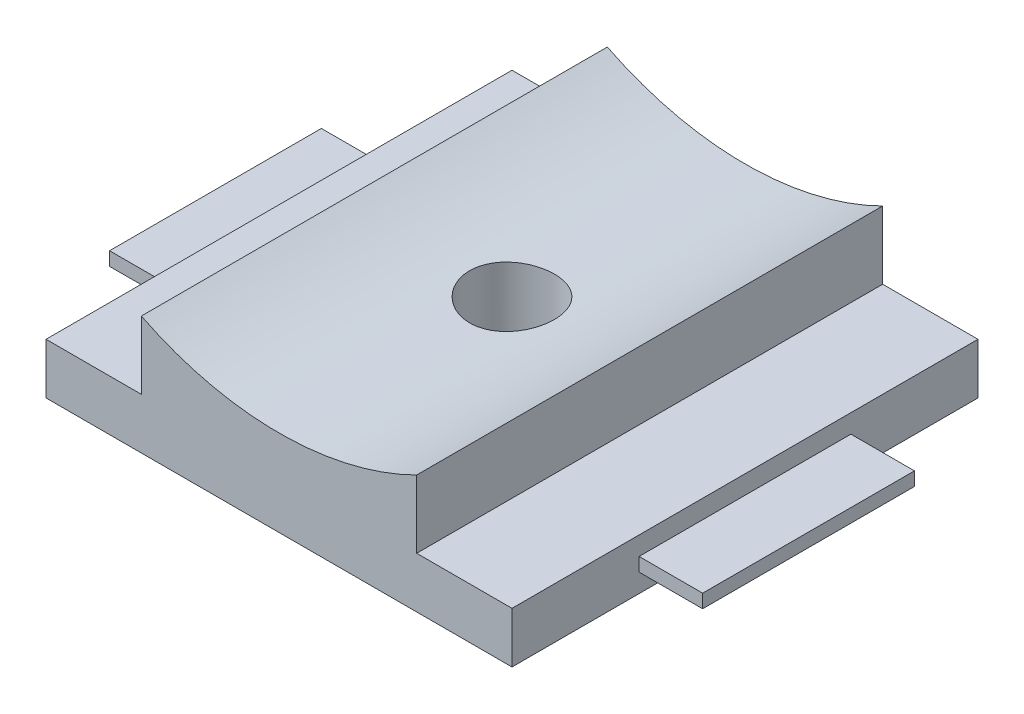
ISO-10303-21;
HEADER;
FILE_DESCRIPTION(('STEP AP214'),'2;1');
FILE_NAME('part.step','',(''),(''),'','','');
FILE_SCHEMA(('AUTOMOTIVE_DESIGN { 1 0 10303 214 1 1 1 1 }'));
ENDSEC;
DATA;
#1=APPLICATION_CONTEXT('core data for automotive mechanical design processes');
#2=APPLICATION_PROTOCOL_DEFINITION('international standard','automotive_design',2000,#1);
#3=PRODUCT_CONTEXT('',#1,'mechanical');
#4=PRODUCT('Part','Part','',(#3));
#5=PRODUCT_RELATED_PRODUCT_CATEGORY('part','',(#4));
#6=PRODUCT_DEFINITION_FORMATION('','',#4);
#7=PRODUCT_DEFINITION_CONTEXT('part definition',#1,'design');
#8=PRODUCT_DEFINITION('design','',#6,#7);
#9=PRODUCT_DEFINITION_SHAPE('','',#8);
#10=(LENGTH_UNIT() NAMED_UNIT(*) SI_UNIT(.MILLI.,.METRE.));
#11=(NAMED_UNIT(*) PLANE_ANGLE_UNIT() SI_UNIT($,.RADIAN.));
#12=(NAMED_UNIT(*) SI_UNIT($,.STERADIAN.) SOLID_ANGLE_UNIT());
#13=UNCERTAINTY_MEASURE_WITH_UNIT(LENGTH_MEASURE(1.E-05),#10,'distance_accuracy_value','');
#14=(GEOMETRIC_REPRESENTATION_CONTEXT(3) GLOBAL_UNCERTAINTY_ASSIGNED_CONTEXT((#13)) GLOBAL_UNIT_ASSIGNED_CONTEXT((#10,
#11,#12)) REPRESENTATION_CONTEXT('',''));
#15=CARTESIAN_POINT('',(0.,0.,0.));
#16=DIRECTION('',(0.,0.,1.));
#17=DIRECTION('',(1.,0.,0.));
#18=AXIS2_PLACEMENT_3D('',#15,#16,#17);
#19=CARTESIAN_POINT('',(-25.0651297672718,-11.5613793103448,27.94));
#20=DIRECTION('',(1.,0.,0.));
#21=DIRECTION('',(0.,1.,0.));
#22=AXIS2_PLACEMENT_3D('',#19,#20,#21);
#23=PLANE('',#22);
#24=DIRECTION('',(0.,-1.,0.));
#25=VECTOR('',#24,1.);
#26=CARTESIAN_POINT('',(-25.0651297672718,-11.5613793103448,0.));
#27=LINE('',#26,#25);
#28=CARTESIAN_POINT('',(-25.0651297672718,-8.51337931034484,0.));
#29=VERTEX_POINT('',#28);
#30=CARTESIAN_POINT('',(-25.0651297672718,-11.5613793103448,0.));
#31=VERTEX_POINT('',#30);
#32=EDGE_CURVE('E317',#29,#31,#27,.T.);
#33=ORIENTED_EDGE('',*,*,#32,.T.);
#34=DIRECTION('',(0.,0.,-1.));
#35=VECTOR('',#34,1.);
#36=CARTESIAN_POINT('',(-25.0651297672718,-11.5613793103448,27.94));
#37=LINE('',#36,#35);
#38=CARTESIAN_POINT('',(-25.0651297672718,-11.5613793103448,27.94));
#39=VERTEX_POINT('',#38);
#40=EDGE_CURVE('E330',#39,#31,#37,.T.);
#41=ORIENTED_EDGE('',*,*,#40,.F.);
#42=DIRECTION('',(0.,-1.,0.));
#43=VECTOR('',#42,1.);
#44=CARTESIAN_POINT('',(-25.0651297672718,-11.5613793103448,27.94));
#45=LINE('',#44,#43);
#46=CARTESIAN_POINT('',(-25.0651297672718,-8.51337931034484,27.94));
#47=VERTEX_POINT('',#46);
#48=EDGE_CURVE('E346',#47,#39,#45,.T.);
#49=ORIENTED_EDGE('',*,*,#48,.F.);
#50=DIRECTION('',(0.,0.,-1.));
#51=VECTOR('',#50,1.);
#52=CARTESIAN_POINT('',(-25.0651297672718,-8.51337931034484,27.94));
#53=LINE('',#52,#51);
#54=EDGE_CURVE('E333',#47,#29,#53,.T.);
#55=ORIENTED_EDGE('',*,*,#54,.T.);
#56=EDGE_LOOP('',(#33,#41,#49,#55));
#57=FACE_BOUND('',#56,.T.);
#58=DIRECTION('',(0.,1.,0.));
#59=VECTOR('',#58,1.);
#60=CARTESIAN_POINT('',(-25.0651297672718,-9.63097931034484,20.32));
#61=LINE('',#60,#59);
#62=CARTESIAN_POINT('',(-25.0651297672718,-10.4437793103448,20.32));
#63=VERTEX_POINT('',#62);
#64=CARTESIAN_POINT('',(-25.0651297672718,-9.63097931034484,20.32));
#65=VERTEX_POINT('',#64);
#66=EDGE_CURVE('E169',#63,#65,#61,.T.);
#67=ORIENTED_EDGE('',*,*,#66,.F.);
#68=DIRECTION('',(0.,0.,1.));
#69=VECTOR('',#68,1.);
#70=CARTESIAN_POINT('',(-25.0651297672718,-10.4437793103448,7.62));
#71=LINE('',#70,#69);
#72=CARTESIAN_POINT('',(-25.0651297672718,-10.4437793103448,7.62));
#73=VERTEX_POINT('',#72);
#74=EDGE_CURVE('E166',#73,#63,#71,.T.);
#75=ORIENTED_EDGE('',*,*,#74,.F.);
#76=DIRECTION('',(0.,-1.,0.));
#77=VECTOR('',#76,1.);
#78=CARTESIAN_POINT('',(-25.0651297672718,-9.63097931034484,7.62));
#79=LINE('',#78,#77);
#80=CARTESIAN_POINT('',(-25.0651297672718,-9.63097931034484,7.62));
#81=VERTEX_POINT('',#80);
#82=EDGE_CURVE('E56',#81,#73,#79,.T.);
#83=ORIENTED_EDGE('',*,*,#82,.F.);
#84=DIRECTION('',(0.,0.,-1.));
#85=VECTOR('',#84,1.);
#86=CARTESIAN_POINT('',(-25.0651297672718,-9.63097931034484,7.62));
#87=LINE('',#86,#85);
#88=EDGE_CURVE('E51',#65,#81,#87,.T.);
#89=ORIENTED_EDGE('',*,*,#88,.F.);
#90=EDGE_LOOP('',(#67,#75,#83,#89));
#91=FACE_BOUND('',#90,.T.);
#92=ADVANCED_FACE('F36',(#57,#91),#23,.F.);
#93=CARTESIAN_POINT('',(2.87487023272816,-11.5613793103448,27.94));
#94=DIRECTION('',(-1.,0.,0.));
#95=DIRECTION('',(0.,0.,1.));
#96=AXIS2_PLACEMENT_3D('',#93,#94,#95);
#97=PLANE('',#96);
#98=DIRECTION('',(0.,1.,0.));
#99=VECTOR('',#98,1.);
#100=CARTESIAN_POINT('',(2.87487023272816,-11.5613793103448,0.));
#101=LINE('',#100,#99);
#102=CARTESIAN_POINT('',(2.87487023272816,-11.5613793103448,0.));
#103=VERTEX_POINT('',#102);
#104=CARTESIAN_POINT('',(2.87487023272816,-8.51337931034484,0.));
#105=VERTEX_POINT('',#104);
#106=EDGE_CURVE('E321',#103,#105,#101,.T.);
#107=ORIENTED_EDGE('',*,*,#106,.T.);
#108=DIRECTION('',(0.,0.,-1.));
#109=VECTOR('',#108,1.);
#110=CARTESIAN_POINT('',(2.87487023272816,-8.51337931034484,27.94));
#111=LINE('',#110,#109);
#112=CARTESIAN_POINT('',(2.87487023272816,-8.51337931034484,27.94));
#113=VERTEX_POINT('',#112);
#114=EDGE_CURVE('E323',#113,#105,#111,.T.);
#115=ORIENTED_EDGE('',*,*,#114,.F.);
#116=DIRECTION('',(0.,1.,0.));
#117=VECTOR('',#116,1.);
#118=CARTESIAN_POINT('',(2.87487023272816,-11.5613793103448,27.94));
#119=LINE('',#118,#117);
#120=CARTESIAN_POINT('',(2.87487023272816,-11.5613793103448,27.94));
#121=VERTEX_POINT('',#120);
#122=EDGE_CURVE('E327',#121,#113,#119,.T.);
#123=ORIENTED_EDGE('',*,*,#122,.F.);
#124=DIRECTION('',(0.,0.,-1.));
#125=VECTOR('',#124,1.);
#126=CARTESIAN_POINT('',(2.87487023272816,-11.5613793103448,27.94));
#127=LINE('',#126,#125);
#128=EDGE_CURVE('E326',#121,#103,#127,.T.);
#129=ORIENTED_EDGE('',*,*,#128,.T.);
#130=EDGE_LOOP('',(#107,#115,#123,#129));
#131=FACE_BOUND('',#130,.T.);
#132=DIRECTION('',(0.,-1.,0.));
#133=VECTOR('',#132,1.);
#134=CARTESIAN_POINT('',(2.87487023272816,-10.4437793103448,20.32));
#135=LINE('',#134,#133);
#136=CARTESIAN_POINT('',(2.87487023272816,-9.63097931034484,20.32));
#137=VERTEX_POINT('',#136);
#138=CARTESIAN_POINT('',(2.87487023272816,-10.4437793103448,20.32));
#139=VERTEX_POINT('',#138);
#140=EDGE_CURVE('E170',#137,#139,#135,.T.);
#141=ORIENTED_EDGE('',*,*,#140,.F.);
#142=DIRECTION('',(0.,0.,1.));
#143=VECTOR('',#142,1.);
#144=CARTESIAN_POINT('',(2.87487023272816,-9.63097931034484,7.61999999999997));
#145=LINE('',#144,#143);
#146=CARTESIAN_POINT('',(2.87487023272816,-9.63097931034484,7.61999999999997));
#147=VERTEX_POINT('',#146);
#148=EDGE_CURVE('E183',#147,#137,#145,.T.);
#149=ORIENTED_EDGE('',*,*,#148,.F.);
#150=DIRECTION('',(0.,1.,0.));
#151=VECTOR('',#150,1.);
#152=CARTESIAN_POINT('',(2.87487023272816,-10.4437793103448,7.61999999999997));
#153=LINE('',#152,#151);
#154=CARTESIAN_POINT('',(2.87487023272816,-10.4437793103448,7.61999999999997));
#155=VERTEX_POINT('',#154);
#156=EDGE_CURVE('E192',#155,#147,#153,.T.);
#157=ORIENTED_EDGE('',*,*,#156,.F.);
#158=DIRECTION('',(0.,0.,-1.));
#159=VECTOR('',#158,1.);
#160=CARTESIAN_POINT('',(2.87487023272816,-10.4437793103448,7.61999999999997));
#161=LINE('',#160,#159);
#162=EDGE_CURVE('E173',#139,#155,#161,.T.);
#163=ORIENTED_EDGE('',*,*,#162,.F.);
#164=EDGE_LOOP('',(#141,#149,#157,#163));
#165=FACE_BOUND('',#164,.T.);
#166=ADVANCED_FACE('F262',(#131,#165),#97,.F.);
#167=CARTESIAN_POINT('',(-2.84012976727184,-8.51337931034484,27.94));
#168=DIRECTION('',(0.,-1.,0.));
#169=DIRECTION('',(0.,0.,-1.));
#170=AXIS2_PLACEMENT_3D('',#167,#168,#169);
#171=PLANE('',#170);
#172=DIRECTION('',(-1.,0.,0.));
#173=VECTOR('',#172,1.);
#174=CARTESIAN_POINT('',(-2.84012976727184,-8.51337931034484,0.));
#175=LINE('',#174,#173);
#176=CARTESIAN_POINT('',(-2.84012976727184,-8.51337931034484,0.));
#177=VERTEX_POINT('',#176);
#178=EDGE_CURVE('E218',#105,#177,#175,.T.);
#179=ORIENTED_EDGE('',*,*,#178,.T.);
#180=DIRECTION('',(0.,0.,-1.));
#181=VECTOR('',#180,1.);
#182=CARTESIAN_POINT('',(-2.84012976727184,-8.51337931034484,27.94));
#183=LINE('',#182,#181);
#184=CARTESIAN_POINT('',(-2.84012976727184,-8.51337931034484,27.94));
#185=VERTEX_POINT('',#184);
#186=EDGE_CURVE('E11',#185,#177,#183,.T.);
#187=ORIENTED_EDGE('',*,*,#186,.F.);
#188=DIRECTION('',(-1.,0.,0.));
#189=VECTOR('',#188,1.);
#190=CARTESIAN_POINT('',(-2.84012976727184,-8.51337931034484,27.94));
#191=LINE('',#190,#189);
#192=EDGE_CURVE('E219',#113,#185,#191,.T.);
#193=ORIENTED_EDGE('',*,*,#192,.F.);
#194=ORIENTED_EDGE('',*,*,#114,.T.);
#195=EDGE_LOOP('',(#179,#187,#193,#194));
#196=FACE_BOUND('',#195,.T.);
#197=ADVANCED_FACE('F38',(#196),#171,.F.);
#198=CARTESIAN_POINT('',(-2.84012976727184,-4.44937931034484,27.94));
#199=DIRECTION('',(-1.,0.,0.));
#200=DIRECTION('',(0.,-1.,0.));
#201=AXIS2_PLACEMENT_3D('',#198,#199,#200);
#202=PLANE('',#201);
#203=DIRECTION('',(0.,1.,0.));
#204=VECTOR('',#203,1.);
#205=CARTESIAN_POINT('',(-2.84012976727184,-4.44937931034484,0.));
#206=LINE('',#205,#204);
#207=CARTESIAN_POINT('',(-2.84012976727185,-4.44937931034484,0.));
#208=VERTEX_POINT('',#207);
#209=EDGE_CURVE('E292',#177,#208,#206,.T.);
#210=ORIENTED_EDGE('',*,*,#209,.T.);
#211=DIRECTION('',(0.,0.,-1.));
#212=VECTOR('',#211,1.);
#213=CARTESIAN_POINT('',(-2.84012976727185,-4.44937931034484,27.94));
#214=LINE('',#213,#212);
#215=CARTESIAN_POINT('',(-2.84012976727185,-4.44937931034484,27.94));
#216=VERTEX_POINT('',#215);
#217=EDGE_CURVE('E44',#216,#208,#214,.T.);
#218=ORIENTED_EDGE('',*,*,#217,.F.);
#219=DIRECTION('',(0.,1.,0.));
#220=VECTOR('',#219,1.);
#221=CARTESIAN_POINT('',(-2.84012976727184,-4.44937931034484,27.94));
#222=LINE('',#221,#220);
#223=EDGE_CURVE('E348',#185,#216,#222,.T.);
#224=ORIENTED_EDGE('',*,*,#223,.F.);
#225=ORIENTED_EDGE('',*,*,#186,.T.);
#226=EDGE_LOOP('',(#210,#218,#224,#225));
#227=FACE_BOUND('',#226,.T.);
#228=ADVANCED_FACE('F283',(#227),#202,.F.);
#229=CARTESIAN_POINT('',(-11.0951297672718,12.0848958827546,27.94));
#230=DIRECTION('',(0.,0.,-1.));
#231=DIRECTION('',(-1.,0.,0.));
#232=AXIS2_PLACEMENT_3D('',#229,#230,#231);
#233=CYLINDRICAL_SURFACE('',#232,18.4804567357288);
#234=CARTESIAN_POINT('',(-11.0951297672718,-6.39556085297419,11.43));
#235=CARTESIAN_POINT('',(-11.2370850046185,-6.39555871811632,11.4300059516353));
#236=CARTESIAN_POINT('',(-11.3791259428077,-6.39390802551838,11.4419405178968));
#237=CARTESIAN_POINT('',(-11.6592468675783,-6.3874819035263,11.4893566627594));
#238=CARTESIAN_POINT('',(-11.7973227035843,-6.38270331607094,11.5248620400109));
#239=CARTESIAN_POINT('',(-12.0654182187066,-6.37055910756894,11.6183467380159));
#240=CARTESIAN_POINT('',(-12.1954435624347,-6.36319533045884,11.6763100432635));
#241=CARTESIAN_POINT('',(-12.4438994287632,-6.34669721478052,11.8130281833147));
#242=CARTESIAN_POINT('',(-12.5623317554134,-6.33756315235695,11.8917797760711));
#243=CARTESIAN_POINT('',(-12.7850443101463,-6.3184748830856,12.0683941104031));
#244=CARTESIAN_POINT('',(-12.8892368971064,-6.30851615437528,12.166366891099));
#245=CARTESIAN_POINT('',(-13.0797568598509,-6.28893690946677,12.3784059181968));
#246=CARTESIAN_POINT('',(-13.1660832713443,-6.27931641154716,12.4924730326996));
#247=CARTESIAN_POINT('',(-13.3187541367384,-6.26145877326471,12.73404189918));
#248=CARTESIAN_POINT('',(-13.3850151569322,-6.25322747038395,12.8615968498556));
#249=CARTESIAN_POINT('',(-13.4951413469002,-6.23914097170586,13.1261566447882));
#250=CARTESIAN_POINT('',(-13.5390075410204,-6.23328566723217,13.2631610564986));
#251=CARTESIAN_POINT('',(-13.6028296429695,-6.22465800546942,13.5418148906626));
#252=CARTESIAN_POINT('',(-13.6229345880178,-6.22186643952747,13.6834295727047));
#253=CARTESIAN_POINT('',(-13.6391249140094,-6.21962379630398,13.9680481750938));
#254=CARTESIAN_POINT('',(-13.6352114565214,-6.22017255747881,14.1110520279244));
#255=CARTESIAN_POINT('',(-13.6035981447415,-6.22453098955683,14.3933442623704));
#256=CARTESIAN_POINT('',(-13.5760633204699,-6.22831803567964,14.5326515246263));
#257=CARTESIAN_POINT('',(-13.4982467794128,-6.23869102463811,14.8046494720401));
#258=CARTESIAN_POINT('',(-13.4479645143433,-6.24527703493728,14.9373399976285));
#259=CARTESIAN_POINT('',(-13.3259057787724,-6.26053122154091,15.1928455288574));
#260=CARTESIAN_POINT('',(-13.2540584576035,-6.26920624229467,15.3156262627666));
#261=CARTESIAN_POINT('',(-13.0909596651142,-6.28765587913944,15.5474510667361));
#262=CARTESIAN_POINT('',(-12.9997071222536,-6.2974305559385,15.6564943776978));
#263=CARTESIAN_POINT('',(-12.7994777543423,-6.31707844430267,15.858706212685));
#264=CARTESIAN_POINT('',(-12.6903588503945,-6.3269517953393,15.9517340948759));
#265=CARTESIAN_POINT('',(-12.4579810747602,-6.34560822422692,16.118176364527));
#266=CARTESIAN_POINT('',(-12.3347221577677,-6.35439129858436,16.1915906891409));
#267=CARTESIAN_POINT('',(-12.0774483747034,-6.36988469953634,16.3167253594726));
#268=CARTESIAN_POINT('',(-11.9434286932245,-6.37659409157866,16.368435927645));
#269=CARTESIAN_POINT('',(-11.6684953499823,-6.38717604362951,16.4485785305161));
#270=CARTESIAN_POINT('',(-11.527582079405,-6.39104876440993,16.477011884491));
#271=CARTESIAN_POINT('',(-11.244076561757,-6.39549994208411,16.5096084099604));
#272=CARTESIAN_POINT('',(-11.1015069657038,-6.39610466988919,16.5139651363363));
#273=CARTESIAN_POINT('',(-10.8176714940732,-6.39402293268918,16.4987969368294));
#274=CARTESIAN_POINT('',(-10.6764055848693,-6.39133655281302,16.4792726286618));
#275=CARTESIAN_POINT('',(-10.3997658402212,-6.3829907337486,16.41705746467));
#276=CARTESIAN_POINT('',(-10.2643706420264,-6.37734326419611,16.3744598554741));
#277=CARTESIAN_POINT('',(-10.0026447628477,-6.36370696377373,16.267404882889));
#278=CARTESIAN_POINT('',(-9.87631444723534,-6.35571803859441,16.202946638978));
#279=CARTESIAN_POINT('',(-9.63544626719001,-6.33822263732008,16.0535386017454));
#280=CARTESIAN_POINT('',(-9.52098602209213,-6.32870709668226,15.9684647546945));
#281=CARTESIAN_POINT('',(-9.30789909517379,-6.30924878260426,15.7804146116085));
#282=CARTESIAN_POINT('',(-9.20927317967029,-6.29930598851627,15.6774374496279));
#283=CARTESIAN_POINT('',(-9.02995942622312,-6.28003164461012,15.4556468202003));
#284=CARTESIAN_POINT('',(-8.94940059173281,-6.27070480651219,15.3367285854094));
#285=CARTESIAN_POINT('',(-8.80940157232149,-6.25379876443718,15.0869351546344));
#286=CARTESIAN_POINT('',(-8.7499608916268,-6.24621951943475,14.9560602394382));
#287=CARTESIAN_POINT('',(-8.65409012310621,-6.23369993588839,14.6864697034525));
#288=CARTESIAN_POINT('',(-8.61758961292544,-6.2287515284072,14.5477795169532));
#289=CARTESIAN_POINT('',(-8.56840970264324,-6.22203158345743,14.2661653675084));
#290=CARTESIAN_POINT('',(-8.55572894183322,-6.22025986452006,14.1232416468784));
#291=CARTESIAN_POINT('',(-8.55457698705123,-6.22009991352886,13.8385019716439));
#292=CARTESIAN_POINT('',(-8.5659030595303,-6.22168334775049,13.6966868109619));
#293=CARTESIAN_POINT('',(-8.61201151192133,-6.2279940616407,13.4169972863892));
#294=CARTESIAN_POINT('',(-8.64679387674533,-6.23272133928704,13.2791229199636));
#295=CARTESIAN_POINT('',(-8.73876015974912,-6.24477778742934,13.0112695264398));
#296=CARTESIAN_POINT('',(-8.7959321982814,-6.25210557793648,12.8812863545582));
#297=CARTESIAN_POINT('',(-8.93103497521553,-6.26853936657656,12.6327249191879));
#298=CARTESIAN_POINT('',(-9.00896618643591,-6.27764540521028,12.5141469155514));
#299=CARTESIAN_POINT('',(-9.18412013761002,-6.29670156081235,12.2907282650477));
#300=CARTESIAN_POINT('',(-9.28149359098598,-6.30665790056214,12.1860062930741));
#301=CARTESIAN_POINT('',(-9.49245060757702,-6.32623928675978,11.994314262455));
#302=CARTESIAN_POINT('',(-9.60603795904109,-6.3358642551312,11.9073483639485));
#303=CARTESIAN_POINT('',(-9.84680549219021,-6.35374818003822,11.7532879365115));
#304=CARTESIAN_POINT('',(-9.97404570962065,-6.36200065942779,11.6862865115072));
#305=CARTESIAN_POINT('',(-10.2380203262486,-6.37614541075357,11.5747017818538));
#306=CARTESIAN_POINT('',(-10.3747444608766,-6.38204018909685,11.5300946574925));
#307=CARTESIAN_POINT('',(-10.6092989304482,-6.38941998830717,11.4749787416509));
#308=CARTESIAN_POINT('',(-10.7056642137311,-6.39171130712798,11.4581366757734));
#309=CARTESIAN_POINT('',(-10.8997160564203,-6.39478246705142,11.4356453101007));
#310=CARTESIAN_POINT('',(-10.9974026031122,-6.39556232268823,11.4299959026772));
#311=CARTESIAN_POINT('',(-11.0951297672718,-6.39556085297419,11.43));
#312=B_SPLINE_CURVE_WITH_KNOTS('',3,(#234,#235,#236,#237,#238,#239,#240,#241,#242,#243,#244,
#245,#246,#247,#248,#249,#250,#251,#252,#253,#254,#255,#256,#257,#258,#259,#260,#261,#262,#263,
#264,#265,#266,#267,#268,#269,#270,#271,#272,#273,#274,#275,#276,#277,#278,#279,#280,#281,#282,
#283,#284,#285,#286,#287,#288,#289,#290,#291,#292,#293,#294,#295,#296,#297,#298,#299,#300,#301,
#302,#303,#304,#305,#306,#307,#308,#309,#310,#311),.UNSPECIFIED.,.T.,.F.,(4,2,2,2,2,2,2,2,2,2,2,
2,2,2,2,2,2,2,2,2,2,2,2,2,2,2,2,2,2,2,2,2,2,2,2,2,2,2,4),(0.,0.425508680837677,
0.851447638133645,1.27708340142093,1.70265282366208,2.13073368328559,2.55883764169494,
2.98869799609174,3.41853868678661,3.84566874096832,4.27277813861414,4.69692762608843,
5.12108733742874,5.54665614373719,5.97224845570773,6.40140611616937,6.83056515173887,
7.25991731654005,7.68924514538532,8.11511648017576,8.54097679946406,8.96512878310287,
9.389297853134,9.81608565556967,10.2428941065713,10.672659369029,11.1024145415713,
11.5308439120767,11.9592488077128,12.3840503186861,12.8088515564116,13.2334277052568,
13.6580135252308,14.0860282496219,14.5141431404491,14.944224365531,15.3738471600682,
15.6667856761439,15.9597213753181),.UNSPECIFIED.);
#313=CARTESIAN_POINT('',(-11.0951297672718,-6.39556085297419,11.43));
#314=VERTEX_POINT('',#313);
#315=EDGE_CURVE('E211',#314,#314,#312,.T.);
#316=ORIENTED_EDGE('',*,*,#315,.F.);
#317=EDGE_LOOP('',(#316));
#318=FACE_BOUND('',#317,.T.);
#319=CARTESIAN_POINT('',(-11.0951297672718,12.0848958827546,0.));
#320=DIRECTION('',(0.,0.,-1.));
#321=DIRECTION('',(1.,0.,0.));
#322=AXIS2_PLACEMENT_3D('',#319,#320,#321);
#323=CIRCLE('',#322,18.4804567357288);
#324=CARTESIAN_POINT('',(-19.3501297672718,-4.44937931034484,0.));
#325=VERTEX_POINT('',#324);
#326=EDGE_CURVE('E300',#208,#325,#323,.T.);
#327=ORIENTED_EDGE('',*,*,#326,.T.);
#328=DIRECTION('',(0.,0.,-1.));
#329=VECTOR('',#328,1.);
#330=CARTESIAN_POINT('',(-19.3501297672718,-4.44937931034484,27.94));
#331=LINE('',#330,#329);
#332=CARTESIAN_POINT('',(-19.3501297672718,-4.44937931034484,27.94));
#333=VERTEX_POINT('',#332);
#334=EDGE_CURVE('E306',#333,#325,#331,.T.);
#335=ORIENTED_EDGE('',*,*,#334,.F.);
#336=CARTESIAN_POINT('',(-11.0951297672718,12.0848958827546,27.94));
#337=DIRECTION('',(0.,0.,-1.));
#338=DIRECTION('',(1.,0.,0.));
#339=AXIS2_PLACEMENT_3D('',#336,#337,#338);
#340=CIRCLE('',#339,18.4804567357288);
#341=EDGE_CURVE('E305',#216,#333,#340,.T.);
#342=ORIENTED_EDGE('',*,*,#341,.F.);
#343=ORIENTED_EDGE('',*,*,#217,.T.);
#344=EDGE_LOOP('',(#327,#335,#342,#343));
#345=FACE_BOUND('',#344,.T.);
#346=ADVANCED_FACE('F280',(#318,#345),#233,.F.);
#347=CARTESIAN_POINT('',(-19.3501297672718,-4.44937931034484,27.94));
#348=DIRECTION('',(1.,0.,0.));
#349=DIRECTION('',(0.,0.,-1.));
#350=AXIS2_PLACEMENT_3D('',#347,#348,#349);
#351=PLANE('',#350);
#352=DIRECTION('',(0.,-1.,0.));
#353=VECTOR('',#352,1.);
#354=CARTESIAN_POINT('',(-19.3501297672718,-4.44937931034484,0.));
#355=LINE('',#354,#353);
#356=CARTESIAN_POINT('',(-19.3501297672718,-8.51337931034484,0.));
#357=VERTEX_POINT('',#356);
#358=EDGE_CURVE('E310',#325,#357,#355,.T.);
#359=ORIENTED_EDGE('',*,*,#358,.T.);
#360=DIRECTION('',(0.,0.,-1.));
#361=VECTOR('',#360,1.);
#362=CARTESIAN_POINT('',(-19.3501297672718,-8.51337931034484,27.94));
#363=LINE('',#362,#361);
#364=CARTESIAN_POINT('',(-19.3501297672718,-8.51337931034484,27.94));
#365=VERTEX_POINT('',#364);
#366=EDGE_CURVE('E336',#365,#357,#363,.T.);
#367=ORIENTED_EDGE('',*,*,#366,.F.);
#368=DIRECTION('',(0.,-1.,0.));
#369=VECTOR('',#368,1.);
#370=CARTESIAN_POINT('',(-19.3501297672718,-4.44937931034484,27.94));
#371=LINE('',#370,#369);
#372=EDGE_CURVE('E341',#333,#365,#371,.T.);
#373=ORIENTED_EDGE('',*,*,#372,.F.);
#374=ORIENTED_EDGE('',*,*,#334,.T.);
#375=EDGE_LOOP('',(#359,#367,#373,#374));
#376=FACE_BOUND('',#375,.T.);
#377=ADVANCED_FACE('F276',(#376),#351,.F.);
#378=CARTESIAN_POINT('',(-25.0651297672718,-8.51337931034484,27.94));
#379=DIRECTION('',(0.,-1.,0.));
#380=DIRECTION('',(0.,0.,-1.));
#381=AXIS2_PLACEMENT_3D('',#378,#379,#380);
#382=PLANE('',#381);
#383=DIRECTION('',(-1.,0.,0.));
#384=VECTOR('',#383,1.);
#385=CARTESIAN_POINT('',(-25.0651297672718,-8.51337931034484,0.));
#386=LINE('',#385,#384);
#387=EDGE_CURVE('E312',#357,#29,#386,.T.);
#388=ORIENTED_EDGE('',*,*,#387,.T.);
#389=ORIENTED_EDGE('',*,*,#54,.F.);
#390=DIRECTION('',(-1.,0.,0.));
#391=VECTOR('',#390,1.);
#392=CARTESIAN_POINT('',(-25.0651297672718,-8.51337931034484,27.94));
#393=LINE('',#392,#391);
#394=EDGE_CURVE('E344',#365,#47,#393,.T.);
#395=ORIENTED_EDGE('',*,*,#394,.F.);
#396=ORIENTED_EDGE('',*,*,#366,.T.);
#397=EDGE_LOOP('',(#388,#389,#395,#396));
#398=FACE_BOUND('',#397,.T.);
#399=ADVANCED_FACE('F273',(#398),#382,.F.);
#400=CARTESIAN_POINT('',(-25.0651297672718,-11.5613793103448,27.94));
#401=DIRECTION('',(0.,1.,0.));
#402=DIRECTION('',(0.,0.,1.));
#403=AXIS2_PLACEMENT_3D('',#400,#401,#402);
#404=PLANE('',#403);
#405=CARTESIAN_POINT('',(-11.0951297672718,-11.5613793103448,13.97));
#406=DIRECTION('',(0.,-1.,0.));
#407=DIRECTION('',(0.,0.,-1.));
#408=AXIS2_PLACEMENT_3D('',#405,#406,#407);
#409=CIRCLE('',#408,2.54);
#410=CARTESIAN_POINT('',(-11.0951297672718,-11.5613793103448,11.43));
#411=VERTEX_POINT('',#410);
#412=EDGE_CURVE('E208',#411,#411,#409,.T.);
#413=ORIENTED_EDGE('',*,*,#412,.F.);
#414=EDGE_LOOP('',(#413));
#415=FACE_BOUND('',#414,.T.);
#416=DIRECTION('',(1.,0.,0.));
#417=VECTOR('',#416,1.);
#418=CARTESIAN_POINT('',(-25.0651297672718,-11.5613793103448,0.));
#419=LINE('',#418,#417);
#420=EDGE_CURVE('E319',#31,#103,#419,.T.);
#421=ORIENTED_EDGE('',*,*,#420,.T.);
#422=ORIENTED_EDGE('',*,*,#128,.F.);
#423=DIRECTION('',(1.,0.,0.));
#424=VECTOR('',#423,1.);
#425=CARTESIAN_POINT('',(-25.0651297672718,-11.5613793103448,27.94));
#426=LINE('',#425,#424);
#427=EDGE_CURVE('E352',#39,#121,#426,.T.);
#428=ORIENTED_EDGE('',*,*,#427,.F.);
#429=ORIENTED_EDGE('',*,*,#40,.T.);
#430=EDGE_LOOP('',(#421,#422,#428,#429));
#431=FACE_BOUND('',#430,.T.);
#432=ADVANCED_FACE('F272',(#415,#431),#404,.F.);
#433=CARTESIAN_POINT('',(-11.0951297672718,12.0848958827546,27.94));
#434=DIRECTION('',(0.,0.,1.));
#435=DIRECTION('',(1.,0.,0.));
#436=AXIS2_PLACEMENT_3D('',#433,#434,#435);
#437=PLANE('',#436);
#438=ORIENTED_EDGE('',*,*,#192,.T.);
#439=ORIENTED_EDGE('',*,*,#223,.T.);
#440=ORIENTED_EDGE('',*,*,#341,.T.);
#441=ORIENTED_EDGE('',*,*,#372,.T.);
#442=ORIENTED_EDGE('',*,*,#394,.T.);
#443=ORIENTED_EDGE('',*,*,#48,.T.);
#444=ORIENTED_EDGE('',*,*,#427,.T.);
#445=ORIENTED_EDGE('',*,*,#122,.T.);
#446=EDGE_LOOP('',(#438,#439,#440,#441,#442,#443,#444,#445));
#447=FACE_BOUND('',#446,.T.);
#448=ADVANCED_FACE('F368',(#447),#437,.T.);
#449=CARTESIAN_POINT('',(-11.0951297672718,12.0848958827546,0.));
#450=DIRECTION('',(0.,0.,1.));
#451=DIRECTION('',(1.,0.,0.));
#452=AXIS2_PLACEMENT_3D('',#449,#450,#451);
#453=PLANE('',#452);
#454=ORIENTED_EDGE('',*,*,#178,.F.);
#455=ORIENTED_EDGE('',*,*,#106,.F.);
#456=ORIENTED_EDGE('',*,*,#420,.F.);
#457=ORIENTED_EDGE('',*,*,#32,.F.);
#458=ORIENTED_EDGE('',*,*,#387,.F.);
#459=ORIENTED_EDGE('',*,*,#358,.F.);
#460=ORIENTED_EDGE('',*,*,#326,.F.);
#461=ORIENTED_EDGE('',*,*,#209,.F.);
#462=EDGE_LOOP('',(#454,#455,#456,#457,#458,#459,#460,#461));
#463=FACE_BOUND('',#462,.T.);
#464=ADVANCED_FACE('F308',(#463),#453,.F.);
#465=CARTESIAN_POINT('',(-11.0951297672718,-4.44837931034484,13.97));
#466=DIRECTION('',(0.,-1.,0.));
#467=DIRECTION('',(0.,0.,-1.));
#468=AXIS2_PLACEMENT_3D('',#465,#466,#467);
#469=CYLINDRICAL_SURFACE('',#468,2.54);
#470=ORIENTED_EDGE('',*,*,#412,.T.);
#471=EDGE_LOOP('',(#470));
#472=FACE_BOUND('',#471,.T.);
#473=ORIENTED_EDGE('',*,*,#315,.T.);
#474=EDGE_LOOP('',(#473));
#475=FACE_BOUND('',#474,.T.);
#476=ADVANCED_FACE('F221',(#472,#475),#469,.F.);
#477=CARTESIAN_POINT('',(6.68487023272816,-10.4437793103448,20.32));
#478=DIRECTION('',(0.,0.,-1.));
#479=DIRECTION('',(-1.,0.,0.));
#480=AXIS2_PLACEMENT_3D('',#477,#478,#479);
#481=PLANE('',#480);
#482=ORIENTED_EDGE('',*,*,#140,.T.);
#483=DIRECTION('',(-1.,0.,0.));
#484=VECTOR('',#483,1.);
#485=CARTESIAN_POINT('',(6.68487023272816,-10.4437793103448,20.32));
#486=LINE('',#485,#484);
#487=CARTESIAN_POINT('',(6.68487023272816,-10.4437793103448,20.32));
#488=VERTEX_POINT('',#487);
#489=EDGE_CURVE('E205',#488,#139,#486,.T.);
#490=ORIENTED_EDGE('',*,*,#489,.F.);
#491=DIRECTION('',(0.,-1.,0.));
#492=VECTOR('',#491,1.);
#493=CARTESIAN_POINT('',(6.68487023272816,-10.4437793103448,20.32));
#494=LINE('',#493,#492);
#495=CARTESIAN_POINT('',(6.68487023272816,-9.63097931034484,20.32));
#496=VERTEX_POINT('',#495);
#497=EDGE_CURVE('E179',#496,#488,#494,.T.);
#498=ORIENTED_EDGE('',*,*,#497,.F.);
#499=DIRECTION('',(-1.,0.,0.));
#500=VECTOR('',#499,1.);
#501=CARTESIAN_POINT('',(6.68487023272816,-9.63097931034484,20.32));
#502=LINE('',#501,#500);
#503=EDGE_CURVE('E188',#496,#137,#502,.T.);
#504=ORIENTED_EDGE('',*,*,#503,.T.);
#505=EDGE_LOOP('',(#482,#490,#498,#504));
#506=FACE_BOUND('',#505,.T.);
#507=ADVANCED_FACE('F226',(#506),#481,.F.);
#508=CARTESIAN_POINT('',(6.68487023272816,-10.4437793103448,7.61999999999997));
#509=DIRECTION('',(0.,1.,0.));
#510=DIRECTION('',(0.,0.,1.));
#511=AXIS2_PLACEMENT_3D('',#508,#509,#510);
#512=PLANE('',#511);
#513=ORIENTED_EDGE('',*,*,#162,.T.);
#514=DIRECTION('',(-1.,0.,0.));
#515=VECTOR('',#514,1.);
#516=CARTESIAN_POINT('',(6.68487023272816,-10.4437793103448,7.61999999999997));
#517=LINE('',#516,#515);
#518=CARTESIAN_POINT('',(6.68487023272816,-10.4437793103448,7.61999999999997));
#519=VERTEX_POINT('',#518);
#520=EDGE_CURVE('E202',#519,#155,#517,.T.);
#521=ORIENTED_EDGE('',*,*,#520,.F.);
#522=DIRECTION('',(0.,0.,-1.));
#523=VECTOR('',#522,1.);
#524=CARTESIAN_POINT('',(6.68487023272816,-10.4437793103448,7.61999999999997));
#525=LINE('',#524,#523);
#526=EDGE_CURVE('E182',#488,#519,#525,.T.);
#527=ORIENTED_EDGE('',*,*,#526,.F.);
#528=ORIENTED_EDGE('',*,*,#489,.T.);
#529=EDGE_LOOP('',(#513,#521,#527,#528));
#530=FACE_BOUND('',#529,.T.);
#531=ADVANCED_FACE('F229',(#530),#512,.F.);
#532=CARTESIAN_POINT('',(6.68487023272816,-10.4437793103448,7.61999999999997));
#533=DIRECTION('',(0.,0.,1.));
#534=DIRECTION('',(1.,0.,0.));
#535=AXIS2_PLACEMENT_3D('',#532,#533,#534);
#536=PLANE('',#535);
#537=ORIENTED_EDGE('',*,*,#156,.T.);
#538=DIRECTION('',(-1.,0.,0.));
#539=VECTOR('',#538,1.);
#540=CARTESIAN_POINT('',(6.68487023272816,-9.63097931034484,7.61999999999997));
#541=LINE('',#540,#539);
#542=CARTESIAN_POINT('',(6.68487023272816,-9.63097931034484,7.61999999999997));
#543=VERTEX_POINT('',#542);
#544=EDGE_CURVE('E199',#543,#147,#541,.T.);
#545=ORIENTED_EDGE('',*,*,#544,.F.);
#546=DIRECTION('',(0.,1.,0.));
#547=VECTOR('',#546,1.);
#548=CARTESIAN_POINT('',(6.68487023272816,-10.4437793103448,7.61999999999997));
#549=LINE('',#548,#547);
#550=EDGE_CURVE('E185',#519,#543,#549,.T.);
#551=ORIENTED_EDGE('',*,*,#550,.F.);
#552=ORIENTED_EDGE('',*,*,#520,.T.);
#553=EDGE_LOOP('',(#537,#545,#551,#552));
#554=FACE_BOUND('',#553,.T.);
#555=ADVANCED_FACE('F233',(#554),#536,.F.);
#556=CARTESIAN_POINT('',(6.68487023272816,-9.63097931034484,7.61999999999997));
#557=DIRECTION('',(0.,-1.,0.));
#558=DIRECTION('',(0.,0.,-1.));
#559=AXIS2_PLACEMENT_3D('',#556,#557,#558);
#560=PLANE('',#559);
#561=ORIENTED_EDGE('',*,*,#148,.T.);
#562=ORIENTED_EDGE('',*,*,#503,.F.);
#563=DIRECTION('',(0.,0.,1.));
#564=VECTOR('',#563,1.);
#565=CARTESIAN_POINT('',(6.68487023272816,-9.63097931034484,7.61999999999997));
#566=LINE('',#565,#564);
#567=EDGE_CURVE('E187',#543,#496,#566,.T.);
#568=ORIENTED_EDGE('',*,*,#567,.F.);
#569=ORIENTED_EDGE('',*,*,#544,.T.);
#570=EDGE_LOOP('',(#561,#562,#568,#569));
#571=FACE_BOUND('',#570,.T.);
#572=ADVANCED_FACE('F237',(#571),#560,.F.);
#573=CARTESIAN_POINT('',(6.68487023272816,0.,0.));
#574=DIRECTION('',(1.,0.,0.));
#575=DIRECTION('',(0.,0.,-1.));
#576=AXIS2_PLACEMENT_3D('',#573,#574,#575);
#577=PLANE('',#576);
#578=ORIENTED_EDGE('',*,*,#497,.T.);
#579=ORIENTED_EDGE('',*,*,#526,.T.);
#580=ORIENTED_EDGE('',*,*,#550,.T.);
#581=ORIENTED_EDGE('',*,*,#567,.T.);
#582=EDGE_LOOP('',(#578,#579,#580,#581));
#583=FACE_BOUND('',#582,.T.);
#584=ADVANCED_FACE('F241',(#583),#577,.T.);
#585=CARTESIAN_POINT('',(-28.8751297672719,-9.63097931034484,20.32));
#586=DIRECTION('',(0.,0.,-1.));
#587=DIRECTION('',(-1.,0.,0.));
#588=AXIS2_PLACEMENT_3D('',#585,#586,#587);
#589=PLANE('',#588);
#590=ORIENTED_EDGE('',*,*,#66,.T.);
#591=DIRECTION('',(1.,0.,0.));
#592=VECTOR('',#591,1.);
#593=CARTESIAN_POINT('',(-28.8751297672719,-9.63097931034484,20.32));
#594=LINE('',#593,#592);
#595=CARTESIAN_POINT('',(-28.8751297672719,-9.63097931034484,20.32));
#596=VERTEX_POINT('',#595);
#597=EDGE_CURVE('E150',#596,#65,#594,.T.);
#598=ORIENTED_EDGE('',*,*,#597,.F.);
#599=DIRECTION('',(0.,1.,0.));
#600=VECTOR('',#599,1.);
#601=CARTESIAN_POINT('',(-28.8751297672719,-9.63097931034484,20.32));
#602=LINE('',#601,#600);
#603=CARTESIAN_POINT('',(-28.8751297672719,-10.4437793103448,20.32));
#604=VERTEX_POINT('',#603);
#605=EDGE_CURVE('E157',#604,#596,#602,.T.);
#606=ORIENTED_EDGE('',*,*,#605,.F.);
#607=DIRECTION('',(1.,0.,0.));
#608=VECTOR('',#607,1.);
#609=CARTESIAN_POINT('',(-28.8751297672719,-10.4437793103448,20.32));
#610=LINE('',#609,#608);
#611=EDGE_CURVE('E551',#604,#63,#610,.T.);
#612=ORIENTED_EDGE('',*,*,#611,.T.);
#613=EDGE_LOOP('',(#590,#598,#606,#612));
#614=FACE_BOUND('',#613,.T.);
#615=ADVANCED_FACE('F168',(#614),#589,.F.);
#616=CARTESIAN_POINT('',(-28.8751297672719,-9.63097931034484,7.62));
#617=DIRECTION('',(0.,-1.,0.));
#618=DIRECTION('',(1.,0.,0.));
#619=AXIS2_PLACEMENT_3D('',#616,#617,#618);
#620=PLANE('',#619);
#621=ORIENTED_EDGE('',*,*,#88,.T.);
#622=DIRECTION('',(1.,0.,0.));
#623=VECTOR('',#622,1.);
#624=CARTESIAN_POINT('',(-28.8751297672719,-9.63097931034484,7.62));
#625=LINE('',#624,#623);
#626=CARTESIAN_POINT('',(-28.8751297672719,-9.63097931034484,7.62));
#627=VERTEX_POINT('',#626);
#628=EDGE_CURVE('E153',#627,#81,#625,.T.);
#629=ORIENTED_EDGE('',*,*,#628,.F.);
#630=DIRECTION('',(0.,0.,-1.));
#631=VECTOR('',#630,1.);
#632=CARTESIAN_POINT('',(-28.8751297672719,-9.63097931034484,7.62));
#633=LINE('',#632,#631);
#634=EDGE_CURVE('E146',#596,#627,#633,.T.);
#635=ORIENTED_EDGE('',*,*,#634,.F.);
#636=ORIENTED_EDGE('',*,*,#597,.T.);
#637=EDGE_LOOP('',(#621,#629,#635,#636));
#638=FACE_BOUND('',#637,.T.);
#639=ADVANCED_FACE('F148',(#638),#620,.F.);
#640=CARTESIAN_POINT('',(-28.8751297672719,-9.63097931034484,7.62));
#641=DIRECTION('',(0.,0.,1.));
#642=DIRECTION('',(1.,0.,0.));
#643=AXIS2_PLACEMENT_3D('',#640,#641,#642);
#644=PLANE('',#643);
#645=ORIENTED_EDGE('',*,*,#82,.T.);
#646=DIRECTION('',(1.,0.,0.));
#647=VECTOR('',#646,1.);
#648=CARTESIAN_POINT('',(-28.8751297672719,-10.4437793103448,7.62));
#649=LINE('',#648,#647);
#650=CARTESIAN_POINT('',(-28.8751297672719,-10.4437793103448,7.62));
#651=VERTEX_POINT('',#650);
#652=EDGE_CURVE('E175',#651,#73,#649,.T.);
#653=ORIENTED_EDGE('',*,*,#652,.F.);
#654=DIRECTION('',(0.,-1.,0.));
#655=VECTOR('',#654,1.);
#656=CARTESIAN_POINT('',(-28.8751297672719,-9.63097931034484,7.62));
#657=LINE('',#656,#655);
#658=EDGE_CURVE('E156',#627,#651,#657,.T.);
#659=ORIENTED_EDGE('',*,*,#658,.F.);
#660=ORIENTED_EDGE('',*,*,#628,.T.);
#661=EDGE_LOOP('',(#645,#653,#659,#660));
#662=FACE_BOUND('',#661,.T.);
#663=ADVANCED_FACE('F250',(#662),#644,.F.);
#664=CARTESIAN_POINT('',(-28.8751297672719,-10.4437793103448,7.62));
#665=DIRECTION('',(0.,1.,0.));
#666=DIRECTION('',(-1.,0.,0.));
#667=AXIS2_PLACEMENT_3D('',#664,#665,#666);
#668=PLANE('',#667);
#669=ORIENTED_EDGE('',*,*,#74,.T.);
#670=ORIENTED_EDGE('',*,*,#611,.F.);
#671=DIRECTION('',(0.,0.,1.));
#672=VECTOR('',#671,1.);
#673=CARTESIAN_POINT('',(-28.8751297672719,-10.4437793103448,7.62));
#674=LINE('',#673,#672);
#675=EDGE_CURVE('E162',#651,#604,#674,.T.);
#676=ORIENTED_EDGE('',*,*,#675,.F.);
#677=ORIENTED_EDGE('',*,*,#652,.T.);
#678=EDGE_LOOP('',(#669,#670,#676,#677));
#679=FACE_BOUND('',#678,.T.);
#680=ADVANCED_FACE('F253',(#679),#668,.F.);
#681=CARTESIAN_POINT('',(-28.8751297672719,0.,0.));
#682=DIRECTION('',(-1.,0.,0.));
#683=DIRECTION('',(0.,0.,1.));
#684=AXIS2_PLACEMENT_3D('',#681,#682,#683);
#685=PLANE('',#684);
#686=ORIENTED_EDGE('',*,*,#605,.T.);
#687=ORIENTED_EDGE('',*,*,#634,.T.);
#688=ORIENTED_EDGE('',*,*,#658,.T.);
#689=ORIENTED_EDGE('',*,*,#675,.T.);
#690=EDGE_LOOP('',(#686,#687,#688,#689));
#691=FACE_BOUND('',#690,.T.);
#692=ADVANCED_FACE('F160',(#691),#685,.T.);
#693=CLOSED_SHELL('',(#92,#166,#197,#228,#346,#377,#399,#432,#448,#464,#476,#507,#531,#555,#572,
#584,#615,#639,#663,#680,#692));
#694=MANIFOLD_SOLID_BREP('B2',#693);
#695=ADVANCED_BREP_SHAPE_REPRESENTATION('',(#18,#694),#14);
#696=SHAPE_DEFINITION_REPRESENTATION(#9,#695);
ENDSEC;
END-ISO-10303-21;
